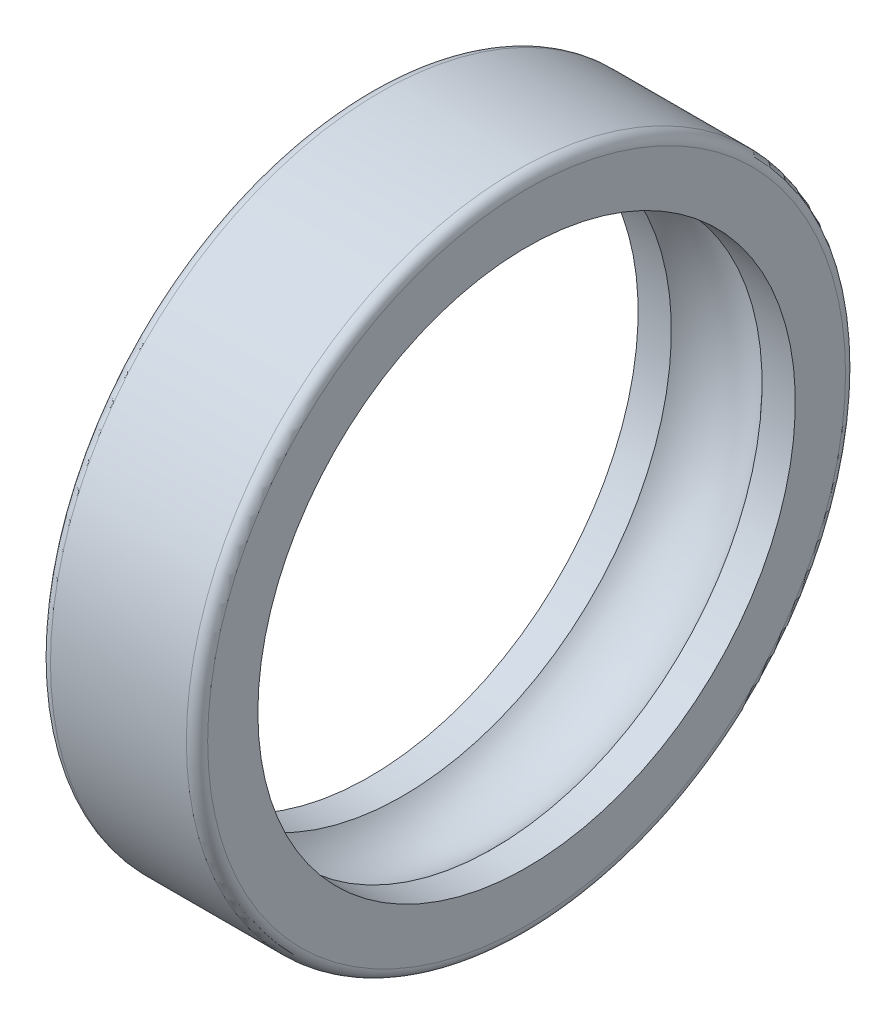
ISO-10303-21;
HEADER;
FILE_DESCRIPTION(('STEP AP214'),'2;1');
FILE_NAME('part.step','',(''),(''),'','','');
FILE_SCHEMA(('AUTOMOTIVE_DESIGN { 1 0 10303 214 1 1 1 1 }'));
ENDSEC;
DATA;
#1=APPLICATION_CONTEXT('core data for automotive mechanical design processes');
#2=APPLICATION_PROTOCOL_DEFINITION('international standard','automotive_design',2000,#1);
#3=PRODUCT_CONTEXT('',#1,'mechanical');
#4=PRODUCT('Part','Part','',(#3));
#5=PRODUCT_RELATED_PRODUCT_CATEGORY('part','',(#4));
#6=PRODUCT_DEFINITION_FORMATION('','',#4);
#7=PRODUCT_DEFINITION_CONTEXT('part definition',#1,'design');
#8=PRODUCT_DEFINITION('design','',#6,#7);
#9=PRODUCT_DEFINITION_SHAPE('','',#8);
#10=(LENGTH_UNIT() NAMED_UNIT(*) SI_UNIT(.MILLI.,.METRE.));
#11=(NAMED_UNIT(*) PLANE_ANGLE_UNIT() SI_UNIT($,.RADIAN.));
#12=(NAMED_UNIT(*) SI_UNIT($,.STERADIAN.) SOLID_ANGLE_UNIT());
#13=UNCERTAINTY_MEASURE_WITH_UNIT(LENGTH_MEASURE(1.E-05),#10,'distance_accuracy_value','');
#14=(GEOMETRIC_REPRESENTATION_CONTEXT(3) GLOBAL_UNCERTAINTY_ASSIGNED_CONTEXT((#13)) GLOBAL_UNIT_ASSIGNED_CONTEXT((#10,
#11,#12)) REPRESENTATION_CONTEXT('',''));
#15=CARTESIAN_POINT('',(0.,0.,0.));
#16=DIRECTION('',(0.,0.,1.));
#17=DIRECTION('',(1.,0.,0.));
#18=AXIS2_PLACEMENT_3D('',#15,#16,#17);
#19=CARTESIAN_POINT('',(-15.5,0.,0.));
#20=DIRECTION('',(-1.,0.,0.));
#21=DIRECTION('',(0.,0.,1.));
#22=AXIS2_PLACEMENT_3D('',#19,#20,#21);
#23=CYLINDRICAL_SURFACE('',#22,53.);
#24=CARTESIAN_POINT('',(-8.94427190999917,0.,0.));
#25=DIRECTION('',(-1.,0.,0.));
#26=DIRECTION('',(0.,0.,1.));
#27=AXIS2_PLACEMENT_3D('',#24,#25,#26);
#28=CIRCLE('',#27,53.);
#29=CARTESIAN_POINT('',(-8.94427190999917,0.,53.));
#30=VERTEX_POINT('',#29);
#31=EDGE_CURVE('E75',#30,#30,#28,.T.);
#32=ORIENTED_EDGE('',*,*,#31,.F.);
#33=EDGE_LOOP('',(#32));
#34=FACE_BOUND('',#33,.T.);
#35=CARTESIAN_POINT('',(-15.5,0.,0.));
#36=DIRECTION('',(-1.,0.,0.));
#37=DIRECTION('',(0.,0.,1.));
#38=AXIS2_PLACEMENT_3D('',#35,#36,#37);
#39=CIRCLE('',#38,53.);
#40=CARTESIAN_POINT('',(-15.5,0.,53.));
#41=VERTEX_POINT('',#40);
#42=EDGE_CURVE('E63',#41,#41,#39,.T.);
#43=ORIENTED_EDGE('',*,*,#42,.T.);
#44=EDGE_LOOP('',(#43));
#45=FACE_BOUND('',#44,.T.);
#46=ADVANCED_FACE('F39',(#34,#45),#23,.F.);
#47=CARTESIAN_POINT('',(-15.5,65.,0.));
#48=DIRECTION('',(1.,0.,0.));
#49=DIRECTION('',(0.,0.,-1.));
#50=AXIS2_PLACEMENT_3D('',#47,#48,#49);
#51=PLANE('',#50);
#52=CARTESIAN_POINT('',(-15.5,0.,0.));
#53=DIRECTION('',(1.,0.,0.));
#54=DIRECTION('',(0.,0.,-1.));
#55=AXIS2_PLACEMENT_3D('',#52,#53,#54);
#56=CIRCLE('',#55,62.9);
#57=CARTESIAN_POINT('',(-15.5,0.,-62.9));
#58=VERTEX_POINT('',#57);
#59=EDGE_CURVE('E10',#58,#58,#56,.F.);
#60=ORIENTED_EDGE('',*,*,#59,.T.);
#61=EDGE_LOOP('',(#60));
#62=FACE_BOUND('',#61,.T.);
#63=ORIENTED_EDGE('',*,*,#42,.F.);
#64=EDGE_LOOP('',(#63));
#65=FACE_BOUND('',#64,.T.);
#66=ADVANCED_FACE('F84',(#62,#65),#51,.F.);
#67=CARTESIAN_POINT('',(-15.5,0.,0.));
#68=DIRECTION('',(-1.,0.,0.));
#69=DIRECTION('',(0.,0.,1.));
#70=AXIS2_PLACEMENT_3D('',#67,#68,#69);
#71=CYLINDRICAL_SURFACE('',#70,65.);
#72=CARTESIAN_POINT('',(13.4,0.,0.));
#73=DIRECTION('',(-1.,0.,0.));
#74=DIRECTION('',(0.,0.,1.));
#75=AXIS2_PLACEMENT_3D('',#72,#73,#74);
#76=CIRCLE('',#75,65.);
#77=CARTESIAN_POINT('',(13.4,0.,65.));
#78=VERTEX_POINT('',#77);
#79=EDGE_CURVE('E52',#78,#78,#76,.T.);
#80=ORIENTED_EDGE('',*,*,#79,.T.);
#81=EDGE_LOOP('',(#80));
#82=FACE_BOUND('',#81,.T.);
#83=CARTESIAN_POINT('',(-13.4,0.,0.));
#84=DIRECTION('',(1.,0.,0.));
#85=DIRECTION('',(0.,0.,-1.));
#86=AXIS2_PLACEMENT_3D('',#83,#84,#85);
#87=CIRCLE('',#86,65.);
#88=CARTESIAN_POINT('',(-13.4,0.,-65.));
#89=VERTEX_POINT('',#88);
#90=EDGE_CURVE('E57',#89,#89,#87,.T.);
#91=ORIENTED_EDGE('',*,*,#90,.T.);
#92=EDGE_LOOP('',(#91));
#93=FACE_BOUND('',#92,.T.);
#94=ADVANCED_FACE('F89',(#82,#93),#71,.T.);
#95=CARTESIAN_POINT('',(15.5,65.,0.));
#96=DIRECTION('',(-1.,0.,0.));
#97=DIRECTION('',(0.,0.,1.));
#98=AXIS2_PLACEMENT_3D('',#95,#96,#97);
#99=PLANE('',#98);
#100=CARTESIAN_POINT('',(15.5,0.,0.));
#101=DIRECTION('',(-1.,0.,0.));
#102=DIRECTION('',(0.,0.,1.));
#103=AXIS2_PLACEMENT_3D('',#100,#101,#102);
#104=CIRCLE('',#103,62.9);
#105=CARTESIAN_POINT('',(15.5,0.,62.9));
#106=VERTEX_POINT('',#105);
#107=EDGE_CURVE('E47',#106,#106,#104,.F.);
#108=ORIENTED_EDGE('',*,*,#107,.T.);
#109=EDGE_LOOP('',(#108));
#110=FACE_BOUND('',#109,.T.);
#111=CARTESIAN_POINT('',(15.5,0.,0.));
#112=DIRECTION('',(-1.,0.,0.));
#113=DIRECTION('',(0.,0.,1.));
#114=AXIS2_PLACEMENT_3D('',#111,#112,#113);
#115=CIRCLE('',#114,53.);
#116=CARTESIAN_POINT('',(15.5,0.,53.));
#117=VERTEX_POINT('',#116);
#118=EDGE_CURVE('E67',#117,#117,#115,.T.);
#119=ORIENTED_EDGE('',*,*,#118,.T.);
#120=EDGE_LOOP('',(#119));
#121=FACE_BOUND('',#120,.T.);
#122=ADVANCED_FACE('F94',(#110,#121),#99,.F.);
#123=CARTESIAN_POINT('',(-15.5,0.,0.));
#124=DIRECTION('',(-1.,0.,0.));
#125=DIRECTION('',(0.,0.,1.));
#126=AXIS2_PLACEMENT_3D('',#123,#124,#125);
#127=CYLINDRICAL_SURFACE('',#126,53.);
#128=ORIENTED_EDGE('',*,*,#118,.F.);
#129=EDGE_LOOP('',(#128));
#130=FACE_BOUND('',#129,.T.);
#131=CARTESIAN_POINT('',(8.94427190999917,0.,0.));
#132=DIRECTION('',(-1.,0.,0.));
#133=DIRECTION('',(0.,0.,1.));
#134=AXIS2_PLACEMENT_3D('',#131,#132,#133);
#135=CIRCLE('',#134,53.);
#136=CARTESIAN_POINT('',(8.94427190999917,0.,53.));
#137=VERTEX_POINT('',#136);
#138=EDGE_CURVE('E71',#137,#137,#135,.T.);
#139=ORIENTED_EDGE('',*,*,#138,.T.);
#140=EDGE_LOOP('',(#139));
#141=FACE_BOUND('',#140,.T.);
#142=ADVANCED_FACE('F106',(#130,#141),#127,.F.);
#143=CARTESIAN_POINT('',(0.,0.,0.));
#144=DIRECTION('',(-1.,0.,0.));
#145=DIRECTION('',(0.,0.,1.));
#146=AXIS2_PLACEMENT_3D('',#143,#144,#145);
#147=TOROIDAL_SURFACE('',#146,45.,12.);
#148=ORIENTED_EDGE('',*,*,#138,.F.);
#149=EDGE_LOOP('',(#148));
#150=FACE_BOUND('',#149,.T.);
#151=ORIENTED_EDGE('',*,*,#31,.T.);
#152=EDGE_LOOP('',(#151));
#153=FACE_BOUND('',#152,.T.);
#154=ADVANCED_FACE('F80',(#150,#153),#147,.F.);
#155=CARTESIAN_POINT('',(13.4,0.,0.));
#156=DIRECTION('',(-1.,0.,0.));
#157=DIRECTION('',(0.,0.,1.));
#158=AXIS2_PLACEMENT_3D('',#155,#156,#157);
#159=TOROIDAL_SURFACE('',#158,62.9,2.1);
#160=ORIENTED_EDGE('',*,*,#107,.F.);
#161=EDGE_LOOP('',(#160));
#162=FACE_BOUND('',#161,.T.);
#163=ORIENTED_EDGE('',*,*,#79,.F.);
#164=EDGE_LOOP('',(#163));
#165=FACE_BOUND('',#164,.T.);
#166=ADVANCED_FACE('F98',(#162,#165),#159,.T.);
#167=CARTESIAN_POINT('',(-13.4,0.,0.));
#168=DIRECTION('',(1.,0.,0.));
#169=DIRECTION('',(0.,0.,-1.));
#170=AXIS2_PLACEMENT_3D('',#167,#168,#169);
#171=TOROIDAL_SURFACE('',#170,62.9,2.1);
#172=ORIENTED_EDGE('',*,*,#90,.F.);
#173=EDGE_LOOP('',(#172));
#174=FACE_BOUND('',#173,.T.);
#175=ORIENTED_EDGE('',*,*,#59,.F.);
#176=EDGE_LOOP('',(#175));
#177=FACE_BOUND('',#176,.T.);
#178=ADVANCED_FACE('F41',(#174,#177),#171,.T.);
#179=CLOSED_SHELL('',(#46,#66,#94,#122,#142,#154,#166,#178));
#180=MANIFOLD_SOLID_BREP('B2',#179);
#181=ADVANCED_BREP_SHAPE_REPRESENTATION('',(#18,#180),#14);
#182=SHAPE_DEFINITION_REPRESENTATION(#9,#181);
ENDSEC;
END-ISO-10303-21;
